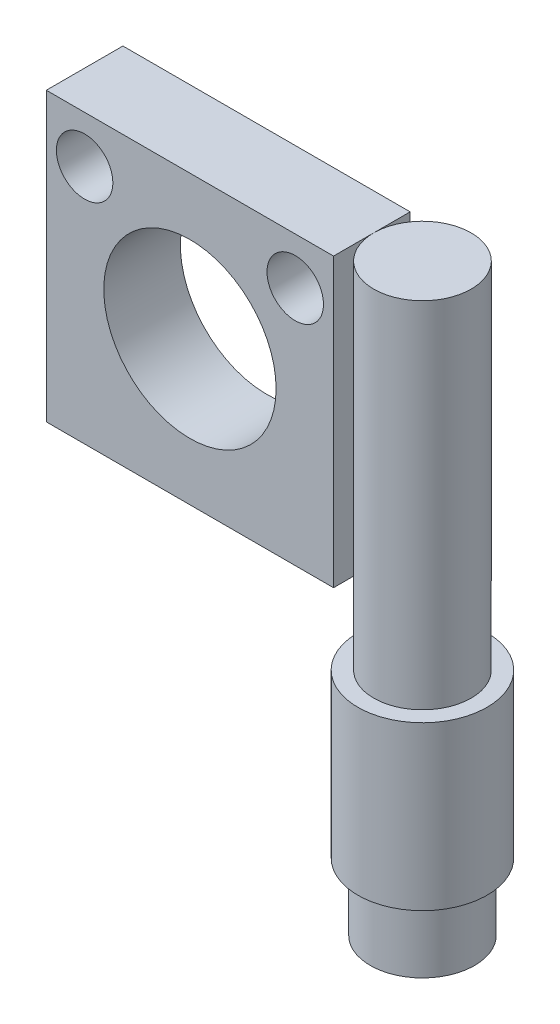
ISO-10303-21;
HEADER;
FILE_DESCRIPTION(('STEP AP214'),'2;1');
FILE_NAME('part.step','',(''),(''),'','','');
FILE_SCHEMA(('AUTOMOTIVE_DESIGN { 1 0 10303 214 1 1 1 1 }'));
ENDSEC;
DATA;
#1=APPLICATION_CONTEXT('core data for automotive mechanical design processes');
#2=APPLICATION_PROTOCOL_DEFINITION('international standard','automotive_design',2000,#1);
#3=PRODUCT_CONTEXT('',#1,'mechanical');
#4=PRODUCT('Part','Part','',(#3));
#5=PRODUCT_RELATED_PRODUCT_CATEGORY('part','',(#4));
#6=PRODUCT_DEFINITION_FORMATION('','',#4);
#7=PRODUCT_DEFINITION_CONTEXT('part definition',#1,'design');
#8=PRODUCT_DEFINITION('design','',#6,#7);
#9=PRODUCT_DEFINITION_SHAPE('','',#8);
#10=(LENGTH_UNIT() NAMED_UNIT(*) SI_UNIT(.MILLI.,.METRE.));
#11=(NAMED_UNIT(*) PLANE_ANGLE_UNIT() SI_UNIT($,.RADIAN.));
#12=(NAMED_UNIT(*) SI_UNIT($,.STERADIAN.) SOLID_ANGLE_UNIT());
#13=UNCERTAINTY_MEASURE_WITH_UNIT(LENGTH_MEASURE(1.E-05),#10,'distance_accuracy_value','');
#14=(GEOMETRIC_REPRESENTATION_CONTEXT(3) GLOBAL_UNCERTAINTY_ASSIGNED_CONTEXT((#13)) GLOBAL_UNIT_ASSIGNED_CONTEXT((#10,
#11,#12)) REPRESENTATION_CONTEXT('',''));
#15=CARTESIAN_POINT('',(0.,0.,0.));
#16=DIRECTION('',(0.,0.,1.));
#17=DIRECTION('',(1.,0.,0.));
#18=AXIS2_PLACEMENT_3D('',#15,#16,#17);
#19=CARTESIAN_POINT('',(20.0879191211051,-39.,3.80242042038792));
#20=DIRECTION('',(0.,-1.,0.));
#21=DIRECTION('',(0.,0.,-1.));
#22=AXIS2_PLACEMENT_3D('',#19,#20,#21);
#23=PLANE('',#22);
#24=CARTESIAN_POINT('',(20.0879191211051,-39.,3.80242042038792));
#25=DIRECTION('',(0.,-1.,0.));
#26=DIRECTION('',(0.,0.,-1.));
#27=AXIS2_PLACEMENT_3D('',#24,#25,#26);
#28=CIRCLE('',#27,6.74477356198674);
#29=CARTESIAN_POINT('',(20.0879191211051,-39.,-2.94235314159882));
#30=VERTEX_POINT('',#29);
#31=EDGE_CURVE('E54',#30,#30,#28,.T.);
#32=ORIENTED_EDGE('',*,*,#31,.T.);
#33=EDGE_LOOP('',(#32));
#34=FACE_BOUND('',#33,.T.);
#35=CARTESIAN_POINT('',(20.0879191211051,-39.,3.80242042038792));
#36=DIRECTION('',(0.,-1.,0.));
#37=DIRECTION('',(0.,0.,-1.));
#38=AXIS2_PLACEMENT_3D('',#35,#36,#37);
#39=CIRCLE('',#38,5.45165924864445);
#40=CARTESIAN_POINT('',(20.0879191211051,-39.,-1.64923882825653));
#41=VERTEX_POINT('',#40);
#42=EDGE_CURVE('E64',#41,#41,#39,.T.);
#43=ORIENTED_EDGE('',*,*,#42,.F.);
#44=EDGE_LOOP('',(#43));
#45=FACE_BOUND('',#44,.T.);
#46=ADVANCED_FACE('F43',(#34,#45),#23,.T.);
#47=CARTESIAN_POINT('',(20.0879191211051,-22.,3.80242042038792));
#48=DIRECTION('',(0.,1.,0.));
#49=DIRECTION('',(0.,0.,1.));
#50=AXIS2_PLACEMENT_3D('',#47,#48,#49);
#51=CYLINDRICAL_SURFACE('',#50,5.08791912110514);
#52=CARTESIAN_POINT('',(20.0879191211051,-22.,3.80242042038792));
#53=DIRECTION('',(0.,-1.,0.));
#54=DIRECTION('',(0.,0.,-1.));
#55=AXIS2_PLACEMENT_3D('',#52,#53,#54);
#56=CIRCLE('',#55,5.08791912110514);
#57=CARTESIAN_POINT('',(20.0879191211051,-22.,-1.28549870071722));
#58=VERTEX_POINT('',#57);
#59=EDGE_CURVE('E50',#58,#58,#56,.F.);
#60=ORIENTED_EDGE('',*,*,#59,.T.);
#61=EDGE_LOOP('',(#60));
#62=FACE_BOUND('',#61,.T.);
#63=CARTESIAN_POINT('',(20.0879191211051,15.,3.80242042038792));
#64=DIRECTION('',(0.,1.,0.));
#65=DIRECTION('',(0.,0.,1.));
#66=AXIS2_PLACEMENT_3D('',#63,#64,#65);
#67=CIRCLE('',#66,5.08791912110514);
#68=CARTESIAN_POINT('',(20.0879191211051,15.,8.89033954149306));
#69=VERTEX_POINT('',#68);
#70=EDGE_CURVE('E11',#69,#69,#67,.T.);
#71=ORIENTED_EDGE('',*,*,#70,.F.);
#72=EDGE_LOOP('',(#71));
#73=FACE_BOUND('',#72,.T.);
#74=ADVANCED_FACE('F45',(#62,#73),#51,.T.);
#75=CARTESIAN_POINT('',(20.0879191211051,15.,3.80242042038792));
#76=DIRECTION('',(0.,1.,0.));
#77=DIRECTION('',(0.,0.,1.));
#78=AXIS2_PLACEMENT_3D('',#75,#76,#77);
#79=PLANE('',#78);
#80=ORIENTED_EDGE('',*,*,#70,.T.);
#81=EDGE_LOOP('',(#80));
#82=FACE_BOUND('',#81,.T.);
#83=ADVANCED_FACE('F85',(#82),#79,.T.);
#84=CARTESIAN_POINT('',(20.0879191211051,-39.,3.80242042038792));
#85=DIRECTION('',(0.,1.,0.));
#86=DIRECTION('',(0.,0.,1.));
#87=AXIS2_PLACEMENT_3D('',#84,#85,#86);
#88=CYLINDRICAL_SURFACE('',#87,6.74477356198674);
#89=ORIENTED_EDGE('',*,*,#31,.F.);
#90=EDGE_LOOP('',(#89));
#91=FACE_BOUND('',#90,.T.);
#92=CARTESIAN_POINT('',(20.0879191211051,-22.,3.80242042038792));
#93=DIRECTION('',(0.,-1.,0.));
#94=DIRECTION('',(0.,0.,-1.));
#95=AXIS2_PLACEMENT_3D('',#92,#93,#94);
#96=CIRCLE('',#95,6.74477356198674);
#97=CARTESIAN_POINT('',(20.0879191211051,-22.,-2.94235314159882));
#98=VERTEX_POINT('',#97);
#99=EDGE_CURVE('E58',#98,#98,#96,.T.);
#100=ORIENTED_EDGE('',*,*,#99,.T.);
#101=EDGE_LOOP('',(#100));
#102=FACE_BOUND('',#101,.T.);
#103=ADVANCED_FACE('F90',(#91,#102),#88,.T.);
#104=CARTESIAN_POINT('',(20.0879191211051,-22.,3.80242042038792));
#105=DIRECTION('',(0.,-1.,0.));
#106=DIRECTION('',(0.,0.,-1.));
#107=AXIS2_PLACEMENT_3D('',#104,#105,#106);
#108=PLANE('',#107);
#109=ORIENTED_EDGE('',*,*,#59,.F.);
#110=EDGE_LOOP('',(#109));
#111=FACE_BOUND('',#110,.T.);
#112=ORIENTED_EDGE('',*,*,#99,.F.);
#113=EDGE_LOOP('',(#112));
#114=FACE_BOUND('',#113,.T.);
#115=ADVANCED_FACE('F75',(#111,#114),#108,.F.);
#116=CARTESIAN_POINT('',(20.0879191211051,-46.,3.80242042038792));
#117=DIRECTION('',(0.,1.,0.));
#118=DIRECTION('',(0.,0.,1.));
#119=AXIS2_PLACEMENT_3D('',#116,#117,#118);
#120=CYLINDRICAL_SURFACE('',#119,5.45165924864445);
#121=CARTESIAN_POINT('',(20.0879191211051,-46.,3.80242042038792));
#122=DIRECTION('',(0.,-1.,0.));
#123=DIRECTION('',(0.,0.,-1.));
#124=AXIS2_PLACEMENT_3D('',#121,#122,#123);
#125=CIRCLE('',#124,5.45165924864445);
#126=CARTESIAN_POINT('',(20.0879191211051,-46.,-1.64923882825653));
#127=VERTEX_POINT('',#126);
#128=EDGE_CURVE('E62',#127,#127,#125,.T.);
#129=ORIENTED_EDGE('',*,*,#128,.F.);
#130=EDGE_LOOP('',(#129));
#131=FACE_BOUND('',#130,.T.);
#132=ORIENTED_EDGE('',*,*,#42,.T.);
#133=EDGE_LOOP('',(#132));
#134=FACE_BOUND('',#133,.T.);
#135=ADVANCED_FACE('F72',(#131,#134),#120,.T.);
#136=CARTESIAN_POINT('',(20.0879191211051,-46.,3.80242042038792));
#137=DIRECTION('',(0.,-1.,0.));
#138=DIRECTION('',(0.,0.,-1.));
#139=AXIS2_PLACEMENT_3D('',#136,#137,#138);
#140=PLANE('',#139);
#141=ORIENTED_EDGE('',*,*,#128,.T.);
#142=EDGE_LOOP('',(#141));
#143=FACE_BOUND('',#142,.T.);
#144=ADVANCED_FACE('F70',(#143),#140,.T.);
#145=CLOSED_SHELL('',(#46,#74,#83,#103,#115,#135,#144));
#146=MANIFOLD_SOLID_BREP('B2',#145);
#147=CARTESIAN_POINT('',(0.,0.,8.));
#148=DIRECTION('',(0.,0.,1.));
#149=DIRECTION('',(1.,0.,0.));
#150=AXIS2_PLACEMENT_3D('',#147,#148,#149);
#151=PLANE('',#150);
#152=CARTESIAN_POINT('',(-11.,10.1,8.));
#153=DIRECTION('',(0.,0.,1.));
#154=DIRECTION('',(1.,0.,0.));
#155=AXIS2_PLACEMENT_3D('',#152,#153,#154);
#156=CIRCLE('',#155,2.95);
#157=CARTESIAN_POINT('',(-8.05,10.1,8.));
#158=VERTEX_POINT('',#157);
#159=EDGE_CURVE('E226',#158,#158,#156,.T.);
#160=ORIENTED_EDGE('',*,*,#159,.F.);
#161=EDGE_LOOP('',(#160));
#162=FACE_BOUND('',#161,.T.);
#163=DIRECTION('',(0.,1.,0.));
#164=VECTOR('',#163,1.);
#165=CARTESIAN_POINT('',(15.,15.,8.));
#166=LINE('',#165,#164);
#167=CARTESIAN_POINT('',(15.,-15.,8.));
#168=VERTEX_POINT('',#167);
#169=CARTESIAN_POINT('',(15.,15.,8.));
#170=VERTEX_POINT('',#169);
#171=EDGE_CURVE('E195',#168,#170,#166,.T.);
#172=ORIENTED_EDGE('',*,*,#171,.T.);
#173=DIRECTION('',(-1.,0.,0.));
#174=VECTOR('',#173,1.);
#175=CARTESIAN_POINT('',(-15.,15.,8.));
#176=LINE('',#175,#174);
#177=CARTESIAN_POINT('',(-15.,15.,8.));
#178=VERTEX_POINT('',#177);
#179=EDGE_CURVE('E191',#170,#178,#176,.T.);
#180=ORIENTED_EDGE('',*,*,#179,.T.);
#181=DIRECTION('',(0.,-1.,0.));
#182=VECTOR('',#181,1.);
#183=CARTESIAN_POINT('',(-15.,15.,8.));
#184=LINE('',#183,#182);
#185=CARTESIAN_POINT('',(-15.,-15.,8.));
#186=VERTEX_POINT('',#185);
#187=EDGE_CURVE('E194',#178,#186,#184,.T.);
#188=ORIENTED_EDGE('',*,*,#187,.T.);
#189=DIRECTION('',(1.,0.,0.));
#190=VECTOR('',#189,1.);
#191=CARTESIAN_POINT('',(-15.,-15.,8.));
#192=LINE('',#191,#190);
#193=EDGE_CURVE('E161',#186,#168,#192,.T.);
#194=ORIENTED_EDGE('',*,*,#193,.T.);
#195=EDGE_LOOP('',(#172,#180,#188,#194));
#196=FACE_BOUND('',#195,.T.);
#197=CARTESIAN_POINT('',(0.,0.,8.));
#198=DIRECTION('',(0.,0.,1.));
#199=DIRECTION('',(1.,0.,0.));
#200=AXIS2_PLACEMENT_3D('',#197,#198,#199);
#201=CIRCLE('',#200,9.);
#202=CARTESIAN_POINT('',(9.,0.,8.));
#203=VERTEX_POINT('',#202);
#204=EDGE_CURVE('E209',#203,#203,#201,.T.);
#205=ORIENTED_EDGE('',*,*,#204,.F.);
#206=EDGE_LOOP('',(#205));
#207=FACE_BOUND('',#206,.T.);
#208=CARTESIAN_POINT('',(11.,10.1,8.));
#209=DIRECTION('',(0.,0.,1.));
#210=DIRECTION('',(-1.,0.,0.));
#211=AXIS2_PLACEMENT_3D('',#208,#209,#210);
#212=CIRCLE('',#211,2.95);
#213=CARTESIAN_POINT('',(8.05,10.1,8.));
#214=VERTEX_POINT('',#213);
#215=EDGE_CURVE('E232',#214,#214,#212,.T.);
#216=ORIENTED_EDGE('',*,*,#215,.F.);
#217=EDGE_LOOP('',(#216));
#218=FACE_BOUND('',#217,.T.);
#219=ADVANCED_FACE('F144',(#162,#196,#207,#218),#151,.T.);
#220=CARTESIAN_POINT('',(0.,0.,0.));
#221=DIRECTION('',(0.,0.,1.));
#222=DIRECTION('',(1.,0.,0.));
#223=AXIS2_PLACEMENT_3D('',#220,#221,#222);
#224=PLANE('',#223);
#225=CARTESIAN_POINT('',(-11.,10.1,0.));
#226=DIRECTION('',(0.,0.,1.));
#227=DIRECTION('',(1.,0.,0.));
#228=AXIS2_PLACEMENT_3D('',#225,#226,#227);
#229=CIRCLE('',#228,2.95);
#230=CARTESIAN_POINT('',(-8.05,10.1,0.));
#231=VERTEX_POINT('',#230);
#232=EDGE_CURVE('E229',#231,#231,#229,.T.);
#233=ORIENTED_EDGE('',*,*,#232,.T.);
#234=EDGE_LOOP('',(#233));
#235=FACE_BOUND('',#234,.T.);
#236=DIRECTION('',(0.,1.,0.));
#237=VECTOR('',#236,1.);
#238=CARTESIAN_POINT('',(15.,15.,0.));
#239=LINE('',#238,#237);
#240=CARTESIAN_POINT('',(15.,-15.,0.));
#241=VERTEX_POINT('',#240);
#242=CARTESIAN_POINT('',(15.,15.,0.));
#243=VERTEX_POINT('',#242);
#244=EDGE_CURVE('E207',#241,#243,#239,.T.);
#245=ORIENTED_EDGE('',*,*,#244,.F.);
#246=DIRECTION('',(1.,0.,0.));
#247=VECTOR('',#246,1.);
#248=CARTESIAN_POINT('',(-15.,-15.,0.));
#249=LINE('',#248,#247);
#250=CARTESIAN_POINT('',(-15.,-15.,0.));
#251=VERTEX_POINT('',#250);
#252=EDGE_CURVE('E212',#251,#241,#249,.T.);
#253=ORIENTED_EDGE('',*,*,#252,.F.);
#254=DIRECTION('',(0.,-1.,0.));
#255=VECTOR('',#254,1.);
#256=CARTESIAN_POINT('',(-15.,15.,0.));
#257=LINE('',#256,#255);
#258=CARTESIAN_POINT('',(-15.,15.,0.));
#259=VERTEX_POINT('',#258);
#260=EDGE_CURVE('E177',#259,#251,#257,.T.);
#261=ORIENTED_EDGE('',*,*,#260,.F.);
#262=DIRECTION('',(-1.,0.,0.));
#263=VECTOR('',#262,1.);
#264=CARTESIAN_POINT('',(-15.,15.,0.));
#265=LINE('',#264,#263);
#266=EDGE_CURVE('E200',#243,#259,#265,.T.);
#267=ORIENTED_EDGE('',*,*,#266,.F.);
#268=EDGE_LOOP('',(#245,#253,#261,#267));
#269=FACE_BOUND('',#268,.T.);
#270=CARTESIAN_POINT('',(0.,0.,0.));
#271=DIRECTION('',(0.,0.,1.));
#272=DIRECTION('',(1.,0.,0.));
#273=AXIS2_PLACEMENT_3D('',#270,#271,#272);
#274=CIRCLE('',#273,9.);
#275=CARTESIAN_POINT('',(9.,0.,0.));
#276=VERTEX_POINT('',#275);
#277=EDGE_CURVE('E223',#276,#276,#274,.T.);
#278=ORIENTED_EDGE('',*,*,#277,.T.);
#279=EDGE_LOOP('',(#278));
#280=FACE_BOUND('',#279,.T.);
#281=CARTESIAN_POINT('',(11.,10.1,0.));
#282=DIRECTION('',(0.,0.,1.));
#283=DIRECTION('',(-1.,0.,0.));
#284=AXIS2_PLACEMENT_3D('',#281,#282,#283);
#285=CIRCLE('',#284,2.95);
#286=CARTESIAN_POINT('',(8.05,10.1,0.));
#287=VERTEX_POINT('',#286);
#288=EDGE_CURVE('E235',#287,#287,#285,.T.);
#289=ORIENTED_EDGE('',*,*,#288,.T.);
#290=EDGE_LOOP('',(#289));
#291=FACE_BOUND('',#290,.T.);
#292=ADVANCED_FACE('F220',(#235,#269,#280,#291),#224,.F.);
#293=CARTESIAN_POINT('',(15.,15.,8.));
#294=DIRECTION('',(-1.,0.,0.));
#295=DIRECTION('',(0.,-1.,0.));
#296=AXIS2_PLACEMENT_3D('',#293,#294,#295);
#297=PLANE('',#296);
#298=DIRECTION('',(0.,0.,-1.));
#299=VECTOR('',#298,1.);
#300=CARTESIAN_POINT('',(15.,-15.,8.));
#301=LINE('',#300,#299);
#302=EDGE_CURVE('E184',#168,#241,#301,.T.);
#303=ORIENTED_EDGE('',*,*,#302,.T.);
#304=ORIENTED_EDGE('',*,*,#244,.T.);
#305=DIRECTION('',(0.,0.,-1.));
#306=VECTOR('',#305,1.);
#307=CARTESIAN_POINT('',(15.,15.,8.));
#308=LINE('',#307,#306);
#309=EDGE_CURVE('E41',#170,#243,#308,.T.);
#310=ORIENTED_EDGE('',*,*,#309,.F.);
#311=ORIENTED_EDGE('',*,*,#171,.F.);
#312=EDGE_LOOP('',(#303,#304,#310,#311));
#313=FACE_BOUND('',#312,.T.);
#314=ADVANCED_FACE('F146',(#313),#297,.F.);
#315=CARTESIAN_POINT('',(-15.,15.,8.));
#316=DIRECTION('',(0.,-1.,0.));
#317=DIRECTION('',(0.,0.,-1.));
#318=AXIS2_PLACEMENT_3D('',#315,#316,#317);
#319=PLANE('',#318);
#320=ORIENTED_EDGE('',*,*,#266,.T.);
#321=DIRECTION('',(0.,0.,-1.));
#322=VECTOR('',#321,1.);
#323=CARTESIAN_POINT('',(-15.,15.,8.));
#324=LINE('',#323,#322);
#325=EDGE_CURVE('E153',#178,#259,#324,.T.);
#326=ORIENTED_EDGE('',*,*,#325,.F.);
#327=ORIENTED_EDGE('',*,*,#179,.F.);
#328=ORIENTED_EDGE('',*,*,#309,.T.);
#329=EDGE_LOOP('',(#320,#326,#327,#328));
#330=FACE_BOUND('',#329,.T.);
#331=ADVANCED_FACE('F198',(#330),#319,.F.);
#332=CARTESIAN_POINT('',(-15.,15.,8.));
#333=DIRECTION('',(1.,0.,0.));
#334=DIRECTION('',(0.,1.,0.));
#335=AXIS2_PLACEMENT_3D('',#332,#333,#334);
#336=PLANE('',#335);
#337=ORIENTED_EDGE('',*,*,#260,.T.);
#338=DIRECTION('',(0.,0.,-1.));
#339=VECTOR('',#338,1.);
#340=CARTESIAN_POINT('',(-15.,-15.,8.));
#341=LINE('',#340,#339);
#342=EDGE_CURVE('E201',#186,#251,#341,.T.);
#343=ORIENTED_EDGE('',*,*,#342,.F.);
#344=ORIENTED_EDGE('',*,*,#187,.F.);
#345=ORIENTED_EDGE('',*,*,#325,.T.);
#346=EDGE_LOOP('',(#337,#343,#344,#345));
#347=FACE_BOUND('',#346,.T.);
#348=ADVANCED_FACE('F202',(#347),#336,.F.);
#349=CARTESIAN_POINT('',(-15.,-15.,8.));
#350=DIRECTION('',(0.,1.,0.));
#351=DIRECTION('',(0.,0.,1.));
#352=AXIS2_PLACEMENT_3D('',#349,#350,#351);
#353=PLANE('',#352);
#354=ORIENTED_EDGE('',*,*,#252,.T.);
#355=ORIENTED_EDGE('',*,*,#302,.F.);
#356=ORIENTED_EDGE('',*,*,#193,.F.);
#357=ORIENTED_EDGE('',*,*,#342,.T.);
#358=EDGE_LOOP('',(#354,#355,#356,#357));
#359=FACE_BOUND('',#358,.T.);
#360=ADVANCED_FACE('F217',(#359),#353,.F.);
#361=CARTESIAN_POINT('',(0.,0.,8.));
#362=DIRECTION('',(0.,0.,-1.));
#363=DIRECTION('',(-1.,0.,0.));
#364=AXIS2_PLACEMENT_3D('',#361,#362,#363);
#365=CYLINDRICAL_SURFACE('',#364,9.);
#366=ORIENTED_EDGE('',*,*,#204,.T.);
#367=EDGE_LOOP('',(#366));
#368=FACE_BOUND('',#367,.T.);
#369=ORIENTED_EDGE('',*,*,#277,.F.);
#370=EDGE_LOOP('',(#369));
#371=FACE_BOUND('',#370,.T.);
#372=ADVANCED_FACE('F254',(#368,#371),#365,.F.);
#373=CARTESIAN_POINT('',(-11.,10.1,8.));
#374=DIRECTION('',(0.,0.,-1.));
#375=DIRECTION('',(-1.,0.,0.));
#376=AXIS2_PLACEMENT_3D('',#373,#374,#375);
#377=CYLINDRICAL_SURFACE('',#376,2.95);
#378=ORIENTED_EDGE('',*,*,#159,.T.);
#379=EDGE_LOOP('',(#378));
#380=FACE_BOUND('',#379,.T.);
#381=ORIENTED_EDGE('',*,*,#232,.F.);
#382=EDGE_LOOP('',(#381));
#383=FACE_BOUND('',#382,.T.);
#384=ADVANCED_FACE('F288',(#380,#383),#377,.F.);
#385=CARTESIAN_POINT('',(11.,10.1,8.));
#386=DIRECTION('',(0.,0.,-1.));
#387=DIRECTION('',(-1.,0.,0.));
#388=AXIS2_PLACEMENT_3D('',#385,#386,#387);
#389=CYLINDRICAL_SURFACE('',#388,2.95);
#390=ORIENTED_EDGE('',*,*,#215,.T.);
#391=EDGE_LOOP('',(#390));
#392=FACE_BOUND('',#391,.T.);
#393=ORIENTED_EDGE('',*,*,#288,.F.);
#394=EDGE_LOOP('',(#393));
#395=FACE_BOUND('',#394,.T.);
#396=ADVANCED_FACE('F241',(#392,#395),#389,.F.);
#397=CLOSED_SHELL('',(#219,#292,#314,#331,#348,#360,#372,#384,#396));
#398=MANIFOLD_SOLID_BREP('B6',#397);
#399=ADVANCED_BREP_SHAPE_REPRESENTATION('',(#18,#146,#398),#14);
#400=SHAPE_DEFINITION_REPRESENTATION(#9,#399);
ENDSEC;
END-ISO-10303-21;
